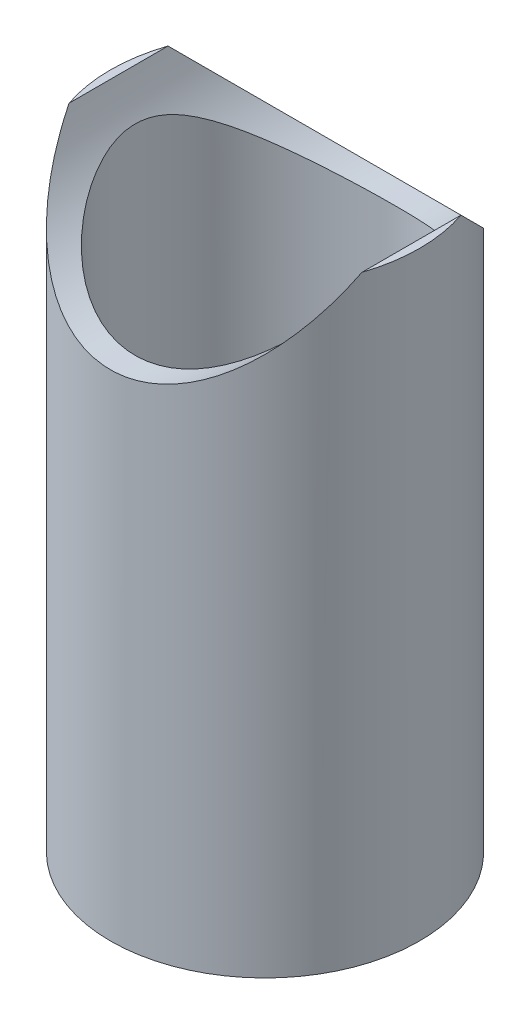
ISO-10303-21;
HEADER;
FILE_DESCRIPTION(('STEP AP214'),'2;1');
FILE_NAME('part.step','',(''),(''),'','','');
FILE_SCHEMA(('AUTOMOTIVE_DESIGN { 1 0 10303 214 1 1 1 1 }'));
ENDSEC;
DATA;
#1=APPLICATION_CONTEXT('core data for automotive mechanical design processes');
#2=APPLICATION_PROTOCOL_DEFINITION('international standard','automotive_design',2000,#1);
#3=PRODUCT_CONTEXT('',#1,'mechanical');
#4=PRODUCT('Part','Part','',(#3));
#5=PRODUCT_RELATED_PRODUCT_CATEGORY('part','',(#4));
#6=PRODUCT_DEFINITION_FORMATION('','',#4);
#7=PRODUCT_DEFINITION_CONTEXT('part definition',#1,'design');
#8=PRODUCT_DEFINITION('design','',#6,#7);
#9=PRODUCT_DEFINITION_SHAPE('','',#8);
#10=(LENGTH_UNIT() NAMED_UNIT(*) SI_UNIT(.MILLI.,.METRE.));
#11=(NAMED_UNIT(*) PLANE_ANGLE_UNIT() SI_UNIT($,.RADIAN.));
#12=(NAMED_UNIT(*) SI_UNIT($,.STERADIAN.) SOLID_ANGLE_UNIT());
#13=UNCERTAINTY_MEASURE_WITH_UNIT(LENGTH_MEASURE(1.E-05),#10,'distance_accuracy_value','');
#14=(GEOMETRIC_REPRESENTATION_CONTEXT(3) GLOBAL_UNCERTAINTY_ASSIGNED_CONTEXT((#13)) GLOBAL_UNIT_ASSIGNED_CONTEXT((#10,
#11,#12)) REPRESENTATION_CONTEXT('',''));
#15=CARTESIAN_POINT('',(0.,0.,0.));
#16=DIRECTION('',(0.,0.,1.));
#17=DIRECTION('',(1.,0.,0.));
#18=AXIS2_PLACEMENT_3D('',#15,#16,#17);
#19=CARTESIAN_POINT('',(0.,48.5,0.));
#20=DIRECTION('',(0.,1.,0.));
#21=DIRECTION('',(0.,0.,1.));
#22=AXIS2_PLACEMENT_3D('',#19,#20,#21);
#23=PLANE('',#22);
#24=DIRECTION('',(0.,0.,1.));
#25=VECTOR('',#24,1.);
#26=CARTESIAN_POINT('',(-11.842719282327,48.5,-12.5));
#27=LINE('',#26,#25);
#28=CARTESIAN_POINT('',(-11.842719282327,48.5,-4.00000000000002));
#29=VERTEX_POINT('',#28);
#30=CARTESIAN_POINT('',(-11.842719282327,48.5,4.00000000000001));
#31=VERTEX_POINT('',#30);
#32=EDGE_CURVE('E72',#29,#31,#27,.T.);
#33=ORIENTED_EDGE('',*,*,#32,.F.);
#34=CARTESIAN_POINT('',(0.,48.5,0.));
#35=DIRECTION('',(0.,1.,0.));
#36=DIRECTION('',(0.,0.,1.));
#37=AXIS2_PLACEMENT_3D('',#34,#35,#36);
#38=CIRCLE('',#37,12.5);
#39=EDGE_CURVE('E49',#29,#31,#38,.T.);
#40=ORIENTED_EDGE('',*,*,#39,.T.);
#41=EDGE_LOOP('',(#33,#40));
#42=FACE_BOUND('',#41,.T.);
#43=ADVANCED_FACE('F34',(#42),#23,.T.);
#44=DIRECTION('',(0.,0.,1.));
#45=VECTOR('',#44,1.);
#46=CARTESIAN_POINT('',(11.842719282327,48.5,-12.5));
#47=LINE('',#46,#45);
#48=CARTESIAN_POINT('',(11.842719282327,48.5,4.00000000000001));
#49=VERTEX_POINT('',#48);
#50=CARTESIAN_POINT('',(11.842719282327,48.5,-4.00000000000002));
#51=VERTEX_POINT('',#50);
#52=EDGE_CURVE('E71',#49,#51,#47,.F.);
#53=ORIENTED_EDGE('',*,*,#52,.F.);
#54=EDGE_CURVE('E11',#49,#51,#38,.T.);
#55=ORIENTED_EDGE('',*,*,#54,.T.);
#56=EDGE_LOOP('',(#53,#55));
#57=FACE_BOUND('',#56,.T.);
#58=ADVANCED_FACE('F77',(#57),#23,.T.);
#59=CARTESIAN_POINT('',(0.,0.,0.));
#60=DIRECTION('',(0.,1.,0.));
#61=DIRECTION('',(0.,0.,1.));
#62=AXIS2_PLACEMENT_3D('',#59,#60,#61);
#63=PLANE('',#62);
#64=CARTESIAN_POINT('',(0.,0.,0.));
#65=DIRECTION('',(0.,1.,0.));
#66=DIRECTION('',(0.,0.,1.));
#67=AXIS2_PLACEMENT_3D('',#64,#65,#66);
#68=CIRCLE('',#67,12.5);
#69=CARTESIAN_POINT('',(0.,0.,12.5));
#70=VERTEX_POINT('',#69);
#71=EDGE_CURVE('E83',#70,#70,#68,.T.);
#72=ORIENTED_EDGE('',*,*,#71,.F.);
#73=EDGE_LOOP('',(#72));
#74=FACE_BOUND('',#73,.T.);
#75=CARTESIAN_POINT('',(0.,0.,0.));
#76=DIRECTION('',(0.,1.,0.));
#77=DIRECTION('',(0.,0.,1.));
#78=AXIS2_PLACEMENT_3D('',#75,#76,#77);
#79=CIRCLE('',#78,10.5);
#80=CARTESIAN_POINT('',(0.,0.,10.5));
#81=VERTEX_POINT('',#80);
#82=EDGE_CURVE('E80',#81,#81,#79,.T.);
#83=ORIENTED_EDGE('',*,*,#82,.T.);
#84=EDGE_LOOP('',(#83));
#85=FACE_BOUND('',#84,.T.);
#86=ADVANCED_FACE('F122',(#74,#85),#63,.F.);
#87=CARTESIAN_POINT('',(0.,48.5,0.));
#88=DIRECTION('',(0.,-1.,0.));
#89=DIRECTION('',(0.,0.,-1.));
#90=AXIS2_PLACEMENT_3D('',#87,#88,#89);
#91=CYLINDRICAL_SURFACE('',#90,12.5);
#92=CARTESIAN_POINT('',(0.,19.,-12.5));
#93=CARTESIAN_POINT('',(-0.218739515789949,18.9999993908735,-12.4999994635907));
#94=CARTESIAN_POINT('',(-0.437486592647651,18.9819985118019,-12.4942046039089));
#95=CARTESIAN_POINT('',(-0.868567253093706,18.9106704511768,-12.4716565543057));
#96=CARTESIAN_POINT('',(-1.08089965843427,18.8573368204552,-12.454901363839));
#97=CARTESIAN_POINT('',(-1.49287306447891,18.7173376969706,-12.4122595908852));
#98=CARTESIAN_POINT('',(-1.69253368346149,18.6307252690735,-12.3863875511298));
#99=CARTESIAN_POINT('',(-2.0744969071279,18.4268579247818,-12.3281725410718));
#100=CARTESIAN_POINT('',(-2.25679651756237,18.309597735586,-12.2958284575098));
#101=CARTESIAN_POINT('',(-2.60473689448745,18.0437897162399,-12.2269266983455));
#102=CARTESIAN_POINT('',(-2.76974023061599,17.8944322526164,-12.1902739433225));
#103=CARTESIAN_POINT('',(-3.07283559233071,17.5703923336315,-12.1174266425772));
#104=CARTESIAN_POINT('',(-3.21092229484498,17.3957048808629,-12.0812321888099));
#105=CARTESIAN_POINT('',(-3.45978487684573,17.0203678637239,-12.012370269974));
#106=CARTESIAN_POINT('',(-3.56975307774839,16.8191592968232,-11.9798196408788));
#107=CARTESIAN_POINT('',(-3.75402292836496,16.3998941405751,-11.9233664449728));
#108=CARTESIAN_POINT('',(-3.82833449433394,16.1818422550308,-11.8994614742253));
#109=CARTESIAN_POINT('',(-3.93682835778228,15.7422934818163,-11.8640030689908));
#110=CARTESIAN_POINT('',(-3.97219742115686,15.5211197456144,-11.8520853732299));
#111=CARTESIAN_POINT('',(-4.00551082647404,15.0756810020443,-11.8408707762137));
#112=CARTESIAN_POINT('',(-4.00346567735333,14.8514168803904,-11.8415703310132));
#113=CARTESIAN_POINT('',(-3.96293451839878,14.4160860377509,-11.8551904771854));
#114=CARTESIAN_POINT('',(-3.92597105327877,14.204858866299,-11.8676004346024));
#115=CARTESIAN_POINT('',(-3.81912647431514,13.7917778888601,-11.9024114349979));
#116=CARTESIAN_POINT('',(-3.74924170672462,13.5899251260173,-11.9248135869381));
#117=CARTESIAN_POINT('',(-3.57749112898224,13.197755352963,-11.9774663544073));
#118=CARTESIAN_POINT('',(-3.47515682759627,13.0076594501287,-12.0078307368189));
#119=CARTESIAN_POINT('',(-3.24173735834848,12.6468448924257,-12.0729361214443));
#120=CARTESIAN_POINT('',(-3.11064442067799,12.4761314931391,-12.1076783053403));
#121=CARTESIAN_POINT('',(-2.81601378851059,12.1503383178364,-12.1796593035711));
#122=CARTESIAN_POINT('',(-2.65122340623531,11.9963980576535,-12.216938020211));
#123=CARTESIAN_POINT('',(-2.29770358054263,11.7180533044153,-12.2883292028654));
#124=CARTESIAN_POINT('',(-2.10897218913167,11.5936512171426,-12.3224414108409));
#125=CARTESIAN_POINT('',(-1.710653951781,11.3770913917996,-12.3840447436164));
#126=CARTESIAN_POINT('',(-1.50090319860161,11.285217247909,-12.411477013699));
#127=CARTESIAN_POINT('',(-1.06783962590281,11.1384010083432,-12.4562040275044));
#128=CARTESIAN_POINT('',(-0.844531157828867,11.0834471304582,-12.4735020051158));
#129=CARTESIAN_POINT('',(-0.400354473973302,11.013999833337,-12.4954856059785));
#130=CARTESIAN_POINT('',(-0.179750715042687,10.9979648159723,-12.5006515044539));
#131=CARTESIAN_POINT('',(0.261025673970264,11.0024480455533,-12.4992163829611));
#132=CARTESIAN_POINT('',(0.481198365218598,11.0229606632747,-12.4926171751051));
#133=CARTESIAN_POINT('',(0.90883754550953,11.0987252827029,-12.4687095079374));
#134=CARTESIAN_POINT('',(1.11648590619506,11.1530497752148,-12.4516871662316));
#135=CARTESIAN_POINT('',(1.51965413650146,11.2937544984906,-12.4089396498837));
#136=CARTESIAN_POINT('',(1.71517248448531,11.3801387415054,-12.3832133859887));
#137=CARTESIAN_POINT('',(2.09399230967611,11.5849275429454,-12.3248882754976));
#138=CARTESIAN_POINT('',(2.27686405125242,11.7040812798558,-12.2921331567523));
#139=CARTESIAN_POINT('',(2.62052875751655,11.9701346824641,-12.223485206012));
#140=CARTESIAN_POINT('',(2.78131543888496,12.1170422161458,-12.187591485802));
#141=CARTESIAN_POINT('',(3.08320803721588,12.4416853990274,-12.1148241820809));
#142=CARTESIAN_POINT('',(3.22321448689051,12.6204506692212,-12.0779721041684));
#143=CARTESIAN_POINT('',(3.47135354981423,12.9997366861455,-12.0090110777536));
#144=CARTESIAN_POINT('',(3.57948642564104,13.2002572536351,-11.9769020901785));
#145=CARTESIAN_POINT('',(3.76018950753079,13.6171089466402,-11.9214065721644));
#146=CARTESIAN_POINT('',(3.83287665768614,13.8333853374742,-11.8979914205013));
#147=CARTESIAN_POINT('',(3.94051670615503,14.2760180245258,-11.8627820424832));
#148=CARTESIAN_POINT('',(3.97548487516417,14.50237020284,-11.8509831134183));
#149=CARTESIAN_POINT('',(4.00556338278915,14.94718992291,-11.8408481974692));
#150=CARTESIAN_POINT('',(4.00248471115016,15.1655225283225,-11.8419004772846));
#151=CARTESIAN_POINT('',(3.96095887873426,15.5983925135868,-11.8558539773436));
#152=CARTESIAN_POINT('',(3.92251352152803,15.8129300864026,-11.8687545933658));
#153=CARTESIAN_POINT('',(3.81258331041153,16.2287085634422,-11.9045135786104));
#154=CARTESIAN_POINT('',(3.74164069856766,16.4301079972322,-11.9272081809191));
#155=CARTESIAN_POINT('',(3.56916068710955,16.818304401002,-11.9799493898591));
#156=CARTESIAN_POINT('',(3.46761685286564,17.0050982894068,-12.009997542498));
#157=CARTESIAN_POINT('',(3.2319816676858,17.367024074536,-12.0755873592094));
#158=CARTESIAN_POINT('',(3.09673271078946,17.5413706568351,-12.111302976317));
#159=CARTESIAN_POINT('',(2.79953499482211,17.8654793645524,-12.1834295211838));
#160=CARTESIAN_POINT('',(2.63757895417057,18.0152347629966,-12.2198406361674));
#161=CARTESIAN_POINT('',(2.28478052574588,18.2911457148096,-12.2907777050029));
#162=CARTESIAN_POINT('',(2.09312837940195,18.4162973797108,-12.3251937970096));
#163=CARTESIAN_POINT('',(1.69040882481734,18.6324504702431,-12.3868446924465));
#164=CARTESIAN_POINT('',(1.47934815802039,18.723463698302,-12.4140819767823));
#165=CARTESIAN_POINT('',(1.05915857911211,18.8631194495761,-12.4567085266016));
#166=CARTESIAN_POINT('',(0.850941916218326,18.9142961264578,-12.4727975325363));
#167=CARTESIAN_POINT('',(0.4284850026903,18.98273285726,-12.4944423385349));
#168=CARTESIAN_POINT('',(0.214246128153487,19.0000005966137,-12.5000005253903));
#169=CARTESIAN_POINT('',(0.,19.,-12.5));
#170=B_SPLINE_CURVE_WITH_KNOTS('',3,(#92,#93,#94,#95,#96,#97,#98,#99,#100,#101,#102,#103,#104,
#105,#106,#107,#108,#109,#110,#111,#112,#113,#114,#115,#116,#117,#118,#119,#120,#121,#122,#123,
#124,#125,#126,#127,#128,#129,#130,#131,#132,#133,#134,#135,#136,#137,#138,#139,#140,#141,#142,
#143,#144,#145,#146,#147,#148,#149,#150,#151,#152,#153,#154,#155,#156,#157,#158,#159,#160,#161,
#162,#163,#164,#165,#166,#167,#168,#169),.UNSPECIFIED.,.T.,.F.,(4,2,2,2,2,2,2,2,2,2,2,2,2,2,2,2,
2,2,2,2,2,2,2,2,2,2,2,2,2,2,2,2,2,2,2,2,2,2,4),(0.,0.655430724666218,1.31098111587091,
1.96549050527928,2.62011257411758,3.29374295378918,3.96750641671065,4.65887072066567,
5.35004264179887,6.01951224998766,6.68879381985559,7.33017723381302,7.97163184802041,
8.62280489842004,9.27415409537618,9.95668212026653,10.6392657156648,11.3276617834058,
12.0158380617097,12.6762752648346,13.3366107533684,13.9795854097457,14.6226405610093,
15.281833876428,15.9412143491714,16.6280748263774,17.3149296449995,17.9995027669286,
18.6837986322709,19.3356533743721,19.9874748761257,20.6287955720839,21.2702512150686,
21.937843916949,22.6056189371905,23.2966571383324,23.9874562112942,24.6295685076846,
25.2715352530413),.UNSPECIFIED.);
#171=CARTESIAN_POINT('',(0.,19.,-12.5));
#172=VERTEX_POINT('',#171);
#173=EDGE_CURVE('E93',#172,#172,#170,.T.);
#174=ORIENTED_EDGE('',*,*,#173,.T.);
#175=EDGE_LOOP('',(#174));
#176=FACE_BOUND('',#175,.T.);
#177=ORIENTED_EDGE('',*,*,#39,.F.);
#178=CARTESIAN_POINT('',(0.,52.5,0.));
#179=DIRECTION('',(0.,-0.707106781186547,0.707106781186548));
#180=DIRECTION('',(0.,-0.707106781186547,-0.707106781186548));
#181=AXIS2_PLACEMENT_3D('',#178,#179,#180);
#182=ELLIPSE('',#181,17.6776695296637,12.5);
#183=EDGE_CURVE('E64',#29,#51,#182,.T.);
#184=ORIENTED_EDGE('',*,*,#183,.T.);
#185=ORIENTED_EDGE('',*,*,#54,.F.);
#186=CARTESIAN_POINT('',(0.,52.5,0.));
#187=DIRECTION('',(0.,-0.707106781186547,-0.707106781186548));
#188=DIRECTION('',(0.,-0.707106781186547,0.707106781186548));
#189=AXIS2_PLACEMENT_3D('',#186,#187,#188);
#190=ELLIPSE('',#189,17.6776695296637,12.5);
#191=EDGE_CURVE('E57',#49,#31,#190,.T.);
#192=ORIENTED_EDGE('',*,*,#191,.T.);
#193=EDGE_LOOP('',(#177,#184,#185,#192));
#194=FACE_BOUND('',#193,.T.);
#195=ORIENTED_EDGE('',*,*,#71,.T.);
#196=EDGE_LOOP('',(#195));
#197=FACE_BOUND('',#196,.T.);
#198=ADVANCED_FACE('F36',(#176,#194,#197),#91,.T.);
#199=CARTESIAN_POINT('',(0.,48.5,0.));
#200=DIRECTION('',(0.,-1.,0.));
#201=DIRECTION('',(0.,0.,-1.));
#202=AXIS2_PLACEMENT_3D('',#199,#200,#201);
#203=CYLINDRICAL_SURFACE('',#202,10.5);
#204=CARTESIAN_POINT('',(0.,19.,-10.5));
#205=CARTESIAN_POINT('',(-0.10816249402773,19.0000005150444,-10.5000003990163));
#206=CARTESIAN_POINT('',(-0.216317226805301,18.9956092681695,-10.498325014305));
#207=CARTESIAN_POINT('',(-0.431849643724885,18.9780899805564,-10.4916697381702));
#208=CARTESIAN_POINT('',(-0.539227073934133,18.9649592043836,-10.4866888121283));
#209=CARTESIAN_POINT('',(-0.752320696488628,18.9300964867436,-10.4735569967627));
#210=CARTESIAN_POINT('',(-0.858037791884633,18.908369402015,-10.4654078974374));
#211=CARTESIAN_POINT('',(-1.0671353505947,18.8565329403734,-10.4461608718977));
#212=CARTESIAN_POINT('',(-1.17051488831636,18.8264203038048,-10.4350617990379));
#213=CARTESIAN_POINT('',(-1.47558283514815,18.724042508179,-10.3978067790511));
#214=CARTESIAN_POINT('',(-1.67285936734757,18.6396281598818,-10.3676498105204));
#215=CARTESIAN_POINT('',(-2.05031727397607,18.4411878776011,-10.299666313908));
#216=CARTESIAN_POINT('',(-2.23049389377237,18.327153740576,-10.2618376618319));
#217=CARTESIAN_POINT('',(-2.5766497031808,18.0674875842774,-10.180554964499));
#218=CARTESIAN_POINT('',(-2.74179208879201,17.9207894427593,-10.1369382145426));
#219=CARTESIAN_POINT('',(-3.04580227070822,17.6022307048775,-10.0497839456605));
#220=CARTESIAN_POINT('',(-3.18466164651555,17.4303620756187,-10.0062464565375));
#221=CARTESIAN_POINT('',(-3.43759067140565,17.0580505873953,-9.92227089475135));
#222=CARTESIAN_POINT('',(-3.55046194725449,16.856746147166,-9.88202363996857));
#223=CARTESIAN_POINT('',(-3.74037141287278,16.4362386628448,-9.81172534045626));
#224=CARTESIAN_POINT('',(-3.81742443699259,16.2170430727797,-9.78167007604848));
#225=CARTESIAN_POINT('',(-3.93017824100957,15.7766341961246,-9.73690200644289));
#226=CARTESIAN_POINT('',(-3.96748208073975,15.5558935959044,-9.72159703172023));
#227=CARTESIAN_POINT('',(-4.00468984551249,15.1107958510282,-9.70633324256615));
#228=CARTESIAN_POINT('',(-4.00460985794797,14.8864403035571,-9.70636782705756));
#229=CARTESIAN_POINT('',(-3.96827544359677,14.4553149514076,-9.72126995333423));
#230=CARTESIAN_POINT('',(-3.93426697528439,14.2483180568447,-9.7352165560286));
#231=CARTESIAN_POINT('',(-3.83476135417431,13.8432273797753,-9.77483723186729));
#232=CARTESIAN_POINT('',(-3.76925930288112,13.6451349875134,-9.80051312934899));
#233=CARTESIAN_POINT('',(-3.60742653694748,13.2589769749522,-9.86123925884152));
#234=CARTESIAN_POINT('',(-3.51052547585192,13.0711785040024,-9.89646077806254));
#235=CARTESIAN_POINT('',(-3.28904350320094,12.7138645896738,-9.97225487445738));
#236=CARTESIAN_POINT('',(-3.16445282285844,12.544355630191,-10.0128293380705));
#237=CARTESIAN_POINT('',(-2.88093153401433,12.2160319347756,-10.098198009063));
#238=CARTESIAN_POINT('',(-2.72021551806992,12.0587803989862,-10.1430894548339));
#239=CARTESIAN_POINT('',(-2.37418548986823,11.772988219828,-10.2296147927583));
#240=CARTESIAN_POINT('',(-2.18886745928642,11.6444522758881,-10.2712481509886));
#241=CARTESIAN_POINT('',(-1.79480303538512,11.4179413582927,-10.3474418684759));
#242=CARTESIAN_POINT('',(-1.58572200847312,11.3205026599626,-10.3818749104512));
#243=CARTESIAN_POINT('',(-1.15249572744745,11.1627052260532,-10.4388398644991));
#244=CARTESIAN_POINT('',(-0.928357439708988,11.1023294722772,-10.4613772380398));
#245=CARTESIAN_POINT('',(-0.484523009213258,11.0234132608212,-10.4910432028467));
#246=CARTESIAN_POINT('',(-0.265252397194593,11.0027687972982,-10.4989458483901));
#247=CARTESIAN_POINT('',(0.173737961654984,10.9977546498181,-10.5008547488942));
#248=CARTESIAN_POINT('',(0.393457593454624,11.013376615127,-10.4948642029118));
#249=CARTESIAN_POINT('',(0.817913686095789,11.078864327976,-10.4701697602295));
#250=CARTESIAN_POINT('',(1.02289813910183,11.1273383153954,-10.4519828724505));
#251=CARTESIAN_POINT('',(1.42166989788425,11.2553073461509,-10.4052481788068));
#252=CARTESIAN_POINT('',(1.61545574573832,11.3348064181774,-10.3766990274081));
#253=CARTESIAN_POINT('',(1.9927891646072,11.5251230211724,-10.3109930092378));
#254=CARTESIAN_POINT('',(2.17586131381993,11.6368010843665,-10.2736055464757));
#255=CARTESIAN_POINT('',(2.52128853254048,11.8873373245465,-10.1943397182704));
#256=CARTESIAN_POINT('',(2.68363574715142,12.0262057566476,-10.1524596611039));
#257=CARTESIAN_POINT('',(2.99318363841576,12.3369615450801,-10.0656958243216));
#258=CARTESIAN_POINT('',(3.13889454803496,12.5103284670112,-10.0207823869792));
#259=CARTESIAN_POINT('',(3.39946665140979,12.8799174370249,-9.93541546836318));
#260=CARTESIAN_POINT('',(3.5143245842607,13.0761418978208,-9.89496245878614));
#261=CARTESIAN_POINT('',(3.71017634656927,13.4877865894829,-9.8232166467957));
#262=CARTESIAN_POINT('',(3.79098632301296,13.7033036052746,-9.79197384330408));
#263=CARTESIAN_POINT('',(3.91461506348578,14.1464156298834,-9.74321766225741));
#264=CARTESIAN_POINT('',(3.95745836544685,14.3740027368118,-9.72569541793324));
#265=CARTESIAN_POINT('',(4.00170805085329,14.8185941351978,-9.70756665590346));
#266=CARTESIAN_POINT('',(4.00566532901142,15.0353040622839,-9.70591893197156));
#267=CARTESIAN_POINT('',(3.97860439692361,15.4661308249143,-9.71704265847931));
#268=CARTESIAN_POINT('',(3.94758972913404,15.6802479208771,-9.72981264848788));
#269=CARTESIAN_POINT('',(3.85347442451017,16.0927282305389,-9.76745395680423));
#270=CARTESIAN_POINT('',(3.7914498042727,16.2913773091394,-9.791918317935));
#271=CARTESIAN_POINT('',(3.63803895458147,16.6755565960333,-9.84994250999594));
#272=CARTESIAN_POINT('',(3.54664519310975,16.8610834240826,-9.88350467380524));
#273=CARTESIAN_POINT('',(3.33140020609057,17.2245759126208,-9.95818178782136));
#274=CARTESIAN_POINT('',(3.20607159301319,17.4016029949418,-9.99960518617515));
#275=CARTESIAN_POINT('',(2.92880801478986,17.7329127794141,-10.0843001164454));
#276=CARTESIAN_POINT('',(2.77686445734789,17.8871881067342,-10.1275722417784));
#277=CARTESIAN_POINT('',(2.44027354764005,18.1775962048772,-10.2140487965206));
#278=CARTESIAN_POINT('',(2.25426250745181,18.3122092231329,-10.257110957244));
#279=CARTESIAN_POINT('',(1.9593594395281,18.4891432262043,-10.3160576713636));
#280=CARTESIAN_POINT('',(1.85833951741952,18.5439845983214,-10.3347758601238));
#281=CARTESIAN_POINT('',(1.65163041646008,18.6449034298382,-10.3698156858563));
#282=CARTESIAN_POINT('',(1.54594322589825,18.6909845776092,-10.3861383307763));
#283=CARTESIAN_POINT('',(1.32443531685051,18.7763423524983,-10.4167693103109));
#284=CARTESIAN_POINT('',(1.20838133448251,18.8150754495795,-10.4309078828893));
#285=CARTESIAN_POINT('',(0.972896990915021,18.8818086519735,-10.455499775536));
#286=CARTESIAN_POINT('',(0.853468150848941,18.9098135124632,-10.4659547281643));
#287=CARTESIAN_POINT('',(0.612288901104484,18.9547625262345,-10.4828293964664));
#288=CARTESIAN_POINT('',(0.490538968994093,18.9717089300621,-10.4892499331887));
#289=CARTESIAN_POINT('',(0.245855911325711,18.9943266323294,-10.4978347281402));
#290=CARTESIAN_POINT('',(0.122922943626598,18.9999994146698,-10.4999995465317));
#291=CARTESIAN_POINT('',(0.,19.,-10.5));
#292=B_SPLINE_CURVE_WITH_KNOTS('',3,(#204,#205,#206,#207,#208,#209,#210,#211,#212,#213,#214,
#215,#216,#217,#218,#219,#220,#221,#222,#223,#224,#225,#226,#227,#228,#229,#230,#231,#232,#233,
#234,#235,#236,#237,#238,#239,#240,#241,#242,#243,#244,#245,#246,#247,#248,#249,#250,#251,#252,
#253,#254,#255,#256,#257,#258,#259,#260,#261,#262,#263,#264,#265,#266,#267,#268,#269,#270,#271,
#272,#273,#274,#275,#276,#277,#278,#279,#280,#281,#282,#283,#284,#285,#286,#287,#288,#289,#290,
#291),.UNSPECIFIED.,.T.,.F.,(4,2,2,2,2,2,2,2,2,2,2,2,2,2,2,2,2,2,2,2,2,2,2,2,2,2,2,2,2,2,2,2,2,
2,2,2,2,2,2,2,2,2,2,4),(0.,0.324371786327612,0.648845147382416,0.973135448801638,
1.29755198566072,1.94440281970489,2.59143298698129,3.26390430627755,3.93659070725503,
4.63589568201203,5.33491077668675,6.00452340011213,6.67384786921408,7.30162176624104,
7.92949333849601,8.56947733254202,9.20968746981433,9.89441427873913,10.5792530641654,
11.2753331376542,11.971093352431,12.6288692357383,13.286493674117,13.9178684674292,
14.5493252737442,15.1995482031768,15.8500168446279,16.5394482941168,17.2289525821686,
17.9221337821842,18.6148666504818,19.2618271918955,19.9087222058254,20.5345843422223,
21.1606071156633,21.8201912873082,22.4799887910923,23.1771058804177,23.52612041901,
23.8749876828147,24.2439123442336,24.6126732939945,24.981359172469,25.3499965191133),.UNSPECIFIED.);
#293=CARTESIAN_POINT('',(0.,19.,-10.5));
#294=VERTEX_POINT('',#293);
#295=EDGE_CURVE('E39',#294,#294,#292,.T.);
#296=ORIENTED_EDGE('',*,*,#295,.F.);
#297=EDGE_LOOP('',(#296));
#298=FACE_BOUND('',#297,.T.);
#299=CARTESIAN_POINT('',(0.,40.,-10.5));
#300=CARTESIAN_POINT('',(0.248562084588282,40.0000021322651,-10.4999978268656));
#301=CARTESIAN_POINT('',(0.497166276236075,40.0074307780488,-10.4911572154357));
#302=CARTESIAN_POINT('',(0.992356714631305,40.0369822461103,-10.4559504919801));
#303=CARTESIAN_POINT('',(1.2389417862411,40.0591130842341,-10.4295748195822));
#304=CARTESIAN_POINT('',(1.72842752580616,40.1176171962477,-10.3597185683379));
#305=CARTESIAN_POINT('',(1.97132050731128,40.1540168240968,-10.3162063381661));
#306=CARTESIAN_POINT('',(2.45117661916314,40.2402619068266,-10.212834534971));
#307=CARTESIAN_POINT('',(2.68813899011461,40.2901090740922,-10.1529728800298));
#308=CARTESIAN_POINT('',(3.1530101590087,40.4018474189856,-10.0183180853129));
#309=CARTESIAN_POINT('',(3.3809694417384,40.4636546591484,-9.94362891750097));
#310=CARTESIAN_POINT('',(3.82834267194039,40.5983876408329,-9.78010852873046));
#311=CARTESIAN_POINT('',(4.04775656080019,40.6713134585997,-9.69127721079274));
#312=CARTESIAN_POINT('',(4.47710570747059,40.8270541864598,-9.50056280812407));
#313=CARTESIAN_POINT('',(4.68704322706934,40.9098667194416,-9.39868286031208));
#314=CARTESIAN_POINT('',(5.09689877557857,41.0841671218123,-9.18288001519313));
#315=CARTESIAN_POINT('',(5.29681490936725,41.1756566226935,-9.06895485261291));
#316=CARTESIAN_POINT('',(5.75847592808848,41.4014310942219,-8.78567271566155));
#317=CARTESIAN_POINT('',(6.01563656867873,41.5389987216593,-8.61143334929456));
#318=CARTESIAN_POINT('',(6.50976869164252,41.825053804269,-8.24425480363067));
#319=CARTESIAN_POINT('',(6.7467331749579,41.9735450121034,-8.05130919072702));
#320=CARTESIAN_POINT('',(7.20081390093552,42.2787820827151,-7.64792426780393));
#321=CARTESIAN_POINT('',(7.41787802591707,42.4355480164106,-7.43744163186533));
#322=CARTESIAN_POINT('',(7.83144460361016,42.7538952183686,-7.00063855001155));
#323=CARTESIAN_POINT('',(8.02794968707478,42.9154758671279,-6.77432013665647));
#324=CARTESIAN_POINT('',(8.40398245782183,43.2433026487824,-6.30205698836679));
#325=CARTESIAN_POINT('',(8.58311896077279,43.4095792341296,-6.05582210564819));
#326=CARTESIAN_POINT('',(8.92004458965511,43.7399511433739,-5.54759401852089));
#327=CARTESIAN_POINT('',(9.07782656165746,43.9040457197619,-5.28559557545324));
#328=CARTESIAN_POINT('',(9.37116159772917,44.2248299479787,-4.74609601764618));
#329=CARTESIAN_POINT('',(9.50676538103956,44.3815358952126,-4.46863227727921));
#330=CARTESIAN_POINT('',(9.75507515004185,44.6816670765257,-3.89686229776072));
#331=CARTESIAN_POINT('',(9.86780044602849,44.8251034544932,-3.60257053329901));
#332=CARTESIAN_POINT('',(10.0224697947442,45.0295063071446,-3.13527923622864));
#333=CARTESIAN_POINT('',(10.0731768168996,45.0981424570515,-2.96850135318263));
#334=CARTESIAN_POINT('',(10.1668907802346,45.2274013803838,-2.62968260813994));
#335=CARTESIAN_POINT('',(10.2098967037137,45.2880230944244,-2.45764105406098));
#336=CARTESIAN_POINT('',(10.287591966008,45.3992916855299,-2.10886290227498));
#337=CARTESIAN_POINT('',(10.3222967773894,45.4499570883422,-1.9321357323619));
#338=CARTESIAN_POINT('',(10.3828936604183,45.5395079843781,-1.57429963100747));
#339=CARTESIAN_POINT('',(10.408790408989,45.5783997279934,-1.39319307983141));
#340=CARTESIAN_POINT('',(10.451517052049,45.6430817273272,-1.02498360046767));
#341=CARTESIAN_POINT('',(10.468218812576,45.6686865588435,-0.837832615201697));
#342=CARTESIAN_POINT('',(10.4915497315563,45.7045712534454,-0.46143740278924));
#343=CARTESIAN_POINT('',(10.4981799524108,45.7148527329201,-0.272193398547475));
#344=CARTESIAN_POINT('',(10.5011666196754,45.719475756071,0.106532453985569));
#345=CARTESIAN_POINT('',(10.4975253780499,45.7138208867996,0.29601423915942));
#346=CARTESIAN_POINT('',(10.480087650195,45.6869235557159,0.673393642409604));
#347=CARTESIAN_POINT('',(10.4662900152255,45.6656793306683,0.861291078856234));
#348=CARTESIAN_POINT('',(10.4277309410028,45.6069796299068,1.24584765836055));
#349=CARTESIAN_POINT('',(10.4023222741363,45.5685706298578,1.44229448911254));
#350=CARTESIAN_POINT('',(10.3411128953599,45.4775805316548,1.83030347366254));
#351=CARTESIAN_POINT('',(10.3053049655366,45.4249895919274,2.021862133879));
#352=CARTESIAN_POINT('',(10.2239297322322,45.3078970810179,2.3997352107875));
#353=CARTESIAN_POINT('',(10.1783355329049,45.2433627542601,2.5860335406318));
#354=CARTESIAN_POINT('',(10.0781393566931,45.1048378661102,2.9524883784916));
#355=CARTESIAN_POINT('',(10.0235391171123,45.0308491291336,3.13264606299193));
#356=CARTESIAN_POINT('',(9.87023359323051,44.8284367520343,3.59421255120813));
#357=CARTESIAN_POINT('',(9.76484454596291,44.6941852640279,3.87085778052344));
#358=CARTESIAN_POINT('',(9.5338562886521,44.4136737166125,4.40924766305801));
#359=CARTESIAN_POINT('',(9.40824471107901,44.2674063356021,4.67098306437943));
#360=CARTESIAN_POINT('',(9.13755744006972,43.9679516257532,5.18057633779807));
#361=CARTESIAN_POINT('',(8.9924551278013,43.8147550267677,5.42841456231413));
#362=CARTESIAN_POINT('',(8.68339825610899,43.5057594840583,5.91020118926807));
#363=CARTESIAN_POINT('',(8.51944762695665,43.3499610886343,6.14415247205397));
#364=CARTESIAN_POINT('',(8.16257077466873,43.0298764056377,6.61165191984483));
#365=CARTESIAN_POINT('',(7.96850535431513,42.8656320260651,6.84436089949182));
#366=CARTESIAN_POINT('',(7.55932468571513,42.541346403426,7.29376112028163));
#367=CARTESIAN_POINT('',(7.34420637560988,42.3813057760445,7.51045002345183));
#368=CARTESIAN_POINT('',(6.89332128364505,42.0689300806623,7.92628559222369));
#369=CARTESIAN_POINT('',(6.6575915473344,41.916581933978,8.12546249064649));
#370=CARTESIAN_POINT('',(6.16533139948409,41.6224617237015,8.50501095826824));
#371=CARTESIAN_POINT('',(5.9088073246471,41.4806864633082,8.68538821830809));
#372=CARTESIAN_POINT('',(5.43623426538273,41.2416419034236,8.98648827267997));
#373=CARTESIAN_POINT('',(5.22427701686791,41.1415913191959,9.11144000740812));
#374=CARTESIAN_POINT('',(4.78873076526314,40.9512116639907,9.3476952693627));
#375=CARTESIAN_POINT('',(4.56514445471194,40.8608803573899,9.45900193604528));
#376=CARTESIAN_POINT('',(4.10709315253862,40.6914695492112,9.66669530332886));
#377=CARTESIAN_POINT('',(3.87263111771101,40.6123870129199,9.76308602859867));
#378=CARTESIAN_POINT('',(3.3938271276375,40.4669402421838,9.93966973216893));
#379=CARTESIAN_POINT('',(3.14948503673471,40.4005761824404,10.0198624879745));
#380=CARTESIAN_POINT('',(2.6502872430694,40.2814747709373,10.1633643591521));
#381=CARTESIAN_POINT('',(2.39536065190326,40.2288561407836,10.2265265196215));
#382=CARTESIAN_POINT('',(1.87882869801891,40.1392274619663,10.33390405469));
#383=CARTESIAN_POINT('',(1.61722330966736,40.1022174732185,10.3781193565592));
#384=CARTESIAN_POINT('',(1.0897832191831,40.0447723330956,10.4466763372047));
#385=CARTESIAN_POINT('',(0.823951377755071,40.0243264196533,10.4710309200228));
#386=CARTESIAN_POINT('',(0.29045547056159,40.0005239835333,10.4993791232424));
#387=CARTESIAN_POINT('',(0.0227916407307276,39.9971653002355,10.5033753178904));
#388=CARTESIAN_POINT('',(-0.477160839545771,40.0069404680499,10.4917367375065));
#389=CARTESIAN_POINT('',(-0.709553856169765,40.0180004321448,10.4785705255014));
#390=CARTESIAN_POINT('',(-1.17197868198823,40.0529034087357,10.4369699960918));
#391=CARTESIAN_POINT('',(-1.40201073257876,40.0767451008281,10.4085372557801));
#392=CARTESIAN_POINT('',(-1.8581190314894,40.1367352980729,10.336861123901));
#393=CARTESIAN_POINT('',(-2.08419516501589,40.1728841597365,10.2936173032894));
#394=CARTESIAN_POINT('',(-2.53096816275334,40.2568031141555,10.1929701982608));
#395=CARTESIAN_POINT('',(-2.75166478250151,40.3045737339625,10.1355662716752));
#396=CARTESIAN_POINT('',(-3.1866178984218,40.4109291776178,10.0073431218967));
#397=CARTESIAN_POINT('',(-3.40086963237272,40.4695217802959,9.93651424789957));
#398=CARTESIAN_POINT('',(-3.82187563680372,40.5965702481652,9.78230799862387));
#399=CARTESIAN_POINT('',(-4.02862699580374,40.6650298933131,9.69892581376031));
#400=CARTESIAN_POINT('',(-4.43380261179976,40.8107849955868,9.52052488464063));
#401=CARTESIAN_POINT('',(-4.63222705392571,40.8880802561304,9.42550639927526));
#402=CARTESIAN_POINT('',(-5.02024349331819,41.0504841349749,9.22468964103474));
#403=CARTESIAN_POINT('',(-5.20983370083134,41.1355943262398,9.11888919752903));
#404=CARTESIAN_POINT('',(-5.66199338115723,41.3519280241064,8.84809555288121));
#405=CARTESIAN_POINT('',(-5.91957567022361,41.4868429494654,8.67768328262174));
#406=CARTESIAN_POINT('',(-6.41492226057665,41.7678090229873,8.3182033034679));
#407=CARTESIAN_POINT('',(-6.65267896542988,41.9138643990913,8.12912850382351));
#408=CARTESIAN_POINT('',(-7.10866634301928,42.2144951360662,7.73357542325358));
#409=CARTESIAN_POINT('',(-7.3268469100986,42.3690908105517,7.52705497062528));
#410=CARTESIAN_POINT('',(-7.74296587108011,42.6834596595689,7.09829093084483));
#411=CARTESIAN_POINT('',(-7.94090692812349,42.843232149276,6.8760494188177));
#412=CARTESIAN_POINT('',(-8.32004293022497,43.1677834295321,6.41234926840393));
#413=CARTESIAN_POINT('',(-8.50086668055365,43.3326003828162,6.17061409932166));
#414=CARTESIAN_POINT('',(-8.84156428778837,43.6607317377876,5.67168669603174));
#415=CARTESIAN_POINT('',(-9.00143187147897,43.824045676007,5.41448986684025));
#416=CARTESIAN_POINT('',(-9.29946217194347,44.1442991644684,4.88489251511668));
#417=CARTESIAN_POINT('',(-9.43766816018634,44.3012509462847,4.61252381519073));
#418=CARTESIAN_POINT('',(-9.69180323605071,44.603304845986,4.05138547469954));
#419=CARTESIAN_POINT('',(-9.80774880922952,44.7484156868507,3.76262817809713));
#420=CARTESIAN_POINT('',(-9.9695281601916,44.9589406844805,3.29987333815704));
#421=CARTESIAN_POINT('',(-10.0236392607072,45.0311406811315,3.1318265112228));
#422=CARTESIAN_POINT('',(-10.1240377458319,45.167808300633,2.79026021917177));
#423=CARTESIAN_POINT('',(-10.1703239913213,45.2322747972672,2.61673996160432));
#424=CARTESIAN_POINT('',(-10.2544557026998,45.3514713748519,2.26469164943964));
#425=CARTESIAN_POINT('',(-10.2923151391495,45.406217539901,2.08617244418551));
#426=CARTESIAN_POINT('',(-10.3590680345202,45.5040566635206,1.72438828073241));
#427=CARTESIAN_POINT('',(-10.387966316233,45.5471558887309,1.54112593298243));
#428=CARTESIAN_POINT('',(-10.4365645721059,45.6203131016382,1.16791823944645));
#429=CARTESIAN_POINT('',(-10.456122853831,45.650169738486,0.977914224859425));
#430=CARTESIAN_POINT('',(-10.4848649348557,45.6942442068667,0.595308721239135));
#431=CARTESIAN_POINT('',(-10.4940497703224,45.7084636003452,0.402707493577491));
#432=CARTESIAN_POINT('',(-10.5017579290086,45.7203883624038,0.0168864395907359));
#433=CARTESIAN_POINT('',(-10.5002875313482,45.718103456956,-0.176332955349935));
#434=CARTESIAN_POINT('',(-10.4867466908594,45.6971847479437,-0.561498025197002));
#435=CARTESIAN_POINT('',(-10.4746763194296,45.6785510544998,-0.75344370867398));
#436=CARTESIAN_POINT('',(-10.4428660322922,45.6299752683545,-1.10591724281183));
#437=CARTESIAN_POINT('',(-10.4245345490709,45.6021283657831,-1.26687022981237));
#438=CARTESIAN_POINT('',(-10.3808096964283,45.5364990166708,-1.58578657407983));
#439=CARTESIAN_POINT('',(-10.3554138081778,45.4987130265884,-1.74374884350388));
#440=CARTESIAN_POINT('',(-10.269157817658,45.3722520737184,-2.21254638536511));
#441=CARTESIAN_POINT('',(-10.1982496359929,45.2705067270033,-2.5180772094441));
#442=CARTESIAN_POINT('',(-10.0410318376869,45.0539459283666,-3.08302874769848));
#443=CARTESIAN_POINT('',(-9.95696057832647,44.941442666043,-3.34401063732676));
#444=CARTESIAN_POINT('',(-9.77116172756689,44.7027379033205,-3.8532937376865));
#445=CARTESIAN_POINT('',(-9.66942112175631,44.5765263318742,-4.10158542570502));
#446=CARTESIAN_POINT('',(-9.44912085971315,44.3150487685069,-4.58641509267862));
#447=CARTESIAN_POINT('',(-9.33052153584304,44.1797618309311,-4.82292352138555));
#448=CARTESIAN_POINT('',(-9.0773237506065,43.9042329688937,-5.28406573992813));
#449=CARTESIAN_POINT('',(-8.94272898720666,43.763992194952,-5.50870225713428));
#450=CARTESIAN_POINT('',(-8.64807053223567,43.4718877584619,-5.96143686500247));
#451=CARTESIAN_POINT('',(-8.48689464246937,43.3198850365969,-6.18872139609301));
#452=CARTESIAN_POINT('',(-8.14670231765372,43.016689442335,-6.63014954360722));
#453=CARTESIAN_POINT('',(-7.96768395036033,42.8654966595224,-6.84429173271994));
#454=CARTESIAN_POINT('',(-7.59205152891055,42.566809764475,-7.2587090812635));
#455=CARTESIAN_POINT('',(-7.39545991180505,42.4193112352075,-7.45900136009018));
#456=CARTESIAN_POINT('',(-6.98448615955673,42.1303305530673,-7.84515333692785));
#457=CARTESIAN_POINT('',(-6.77010627469332,41.9888476426118,-8.03101485474084));
#458=CARTESIAN_POINT('',(-6.34520594196477,41.7276088339976,-8.36987988650523));
#459=CARTESIAN_POINT('',(-6.13631361434815,41.6070744288893,-8.52432306971309));
#460=CARTESIAN_POINT('',(-5.70430426019884,41.3747565202051,-8.81925696312383));
#461=CARTESIAN_POINT('',(-5.48118950960325,41.2629716228396,-8.95974989655198));
#462=CARTESIAN_POINT('',(-5.02121411682591,41.0500383147433,-9.22539563694754));
#463=CARTESIAN_POINT('',(-4.7843565751065,40.9488875192592,-9.35055188429448));
#464=CARTESIAN_POINT('',(-4.29766024182441,40.7591187800339,-9.58399248713883));
#465=CARTESIAN_POINT('',(-4.04782417218083,40.6704982227854,-9.69228036145521));
#466=CARTESIAN_POINT('',(-3.57733679945747,40.5207059614009,-9.8744986699181));
#467=CARTESIAN_POINT('',(-3.35841425480748,40.4574111723593,-9.95115411003129));
#468=CARTESIAN_POINT('',(-2.91328663681119,40.3420564381057,-10.0904468224301));
#469=CARTESIAN_POINT('',(-2.68708301427645,40.2899942704377,-10.1530868678548));
#470=CARTESIAN_POINT('',(-2.22911467960863,40.1981514450251,-10.2633525982081));
#471=CARTESIAN_POINT('',(-1.99736269162204,40.1583451362463,-10.3110096464459));
#472=CARTESIAN_POINT('',(-1.52944069655735,40.0916718758747,-10.3907211482993));
#473=CARTESIAN_POINT('',(-1.29327289242712,40.0647986422345,-10.4227831770429));
#474=CARTESIAN_POINT('',(-0.880804976153713,40.0298342426559,-10.4644695357754));
#475=CARTESIAN_POINT('',(-0.70512551219368,40.0186600052402,-10.4777798995309));
#476=CARTESIAN_POINT('',(-0.352971207568597,40.003741404534,-10.4955467639751));
#477=CARTESIAN_POINT('',(-0.17649621893014,39.9999984859448,-10.5000015430753));
#478=CARTESIAN_POINT('',(0.,40.,-10.5));
#479=B_SPLINE_CURVE_WITH_KNOTS('',3,(#299,#300,#301,#302,#303,#304,#305,#306,#307,#308,#309,
#310,#311,#312,#313,#314,#315,#316,#317,#318,#319,#320,#321,#322,#323,#324,#325,#326,#327,#328,
#329,#330,#331,#332,#333,#334,#335,#336,#337,#338,#339,#340,#341,#342,#343,#344,#345,#346,#347,
#348,#349,#350,#351,#352,#353,#354,#355,#356,#357,#358,#359,#360,#361,#362,#363,#364,#365,#366,
#367,#368,#369,#370,#371,#372,#373,#374,#375,#376,#377,#378,#379,#380,#381,#382,#383,#384,#385,
#386,#387,#388,#389,#390,#391,#392,#393,#394,#395,#396,#397,#398,#399,#400,#401,#402,#403,#404,
#405,#406,#407,#408,#409,#410,#411,#412,#413,#414,#415,#416,#417,#418,#419,#420,#421,#422,#423,
#424,#425,#426,#427,#428,#429,#430,#431,#432,#433,#434,#435,#436,#437,#438,#439,#440,#441,#442,
#443,#444,#445,#446,#447,#448,#449,#450,#451,#452,#453,#454,#455,#456,#457,#458,#459,#460,#461,
#462,#463,#464,#465,#466,#467,#468,#469,#470,#471,#472,#473,#474,#475,#476,#477,#478),
.UNSPECIFIED.,.T.,.F.,(4,2,2,2,2,2,2,2,2,2,2,2,2,2,2,2,2,2,2,2,2,2,2,2,2,2,2,2,2,2,2,2,2,2,2,2,
2,2,2,2,2,2,2,2,2,2,2,2,2,2,2,2,2,2,2,2,2,2,2,2,2,2,2,2,2,2,2,2,2,2,2,2,2,2,2,2,2,2,2,2,2,2,2,2,
2,2,2,2,2,4),(0.,0.745493925003591,1.4913946379216,2.23867954415611,2.98605965322778,
3.72837324903,4.47069193543334,5.21283250059809,5.95511288490661,6.97283123284885,
7.99090085302697,9.01156480074004,10.0320979832441,11.0719241754444,12.1120978595352,
13.149858465503,14.1867394865159,14.7484377451124,15.310210177475,15.8709272087599,
16.431346042865,16.9993885738355,17.5673711804032,18.1352259521309,18.7031449610166,
19.3075379792046,19.9123515007788,20.5188490310154,21.125229701803,22.0988768943684,
23.0731218200618,24.0487110797648,25.0240972762609,26.0570666629599,27.0901865050107,
28.1214862275452,29.1524728529127,29.9485980430859,30.7445397156803,31.5402662487619,
32.3360037111806,33.138402403239,33.9408041753792,34.7426841892634,35.544462805726,
36.242696942567,36.9408589629367,37.6390412092292,38.3372551242881,39.035972881858,
39.7349590256005,40.4339296207435,41.1330412121178,42.1426676970921,43.1526792729507,
44.1652063492795,45.1776000240593,46.2084551605932,47.2396181816811,48.2686943380045,
49.2970054190589,49.8688945948473,50.4408669530322,51.0118838725741,51.5825929417742,
52.1617046495789,52.7407585068299,53.3194711558876,53.8981799069331,54.3907794221009,
54.8835548003341,55.8697550516996,56.7576979012712,57.6462975633195,58.5370237674447,
59.4275444447806,60.3789556936366,61.3304700873787,62.2807865074946,63.2309828919394,
64.0893790963404,64.9476382794321,65.805704580977,66.6635916456097,67.3841742413917,
68.1046141336362,68.8235357591851,69.542107825992,70.071357036357,70.6007091264655),.UNSPECIFIED.);
#480=CARTESIAN_POINT('',(0.,40.,-10.5));
#481=VERTEX_POINT('',#480);
#482=EDGE_CURVE('E74',#481,#481,#479,.T.);
#483=ORIENTED_EDGE('',*,*,#482,.F.);
#484=EDGE_LOOP('',(#483));
#485=FACE_BOUND('',#484,.T.);
#486=ORIENTED_EDGE('',*,*,#82,.F.);
#487=EDGE_LOOP('',(#486));
#488=FACE_BOUND('',#487,.T.);
#489=ADVANCED_FACE('F94',(#298,#485,#488),#203,.F.);
#490=CARTESIAN_POINT('',(0.,52.5,-12.5));
#491=DIRECTION('',(0.,0.,1.));
#492=DIRECTION('',(1.,0.,0.));
#493=AXIS2_PLACEMENT_3D('',#490,#491,#492);
#494=CYLINDRICAL_SURFACE('',#493,12.5);
#495=ORIENTED_EDGE('',*,*,#482,.T.);
#496=EDGE_LOOP('',(#495));
#497=FACE_BOUND('',#496,.T.);
#498=ORIENTED_EDGE('',*,*,#32,.T.);
#499=ORIENTED_EDGE('',*,*,#191,.F.);
#500=ORIENTED_EDGE('',*,*,#52,.T.);
#501=ORIENTED_EDGE('',*,*,#183,.F.);
#502=EDGE_LOOP('',(#498,#499,#500,#501));
#503=FACE_BOUND('',#502,.T.);
#504=ADVANCED_FACE('F70',(#497,#503),#494,.F.);
#505=CARTESIAN_POINT('',(0.,15.,-12.5));
#506=DIRECTION('',(0.,0.,1.));
#507=DIRECTION('',(1.,0.,0.));
#508=AXIS2_PLACEMENT_3D('',#505,#506,#507);
#509=CYLINDRICAL_SURFACE('',#508,4.);
#510=ORIENTED_EDGE('',*,*,#295,.T.);
#511=EDGE_LOOP('',(#510));
#512=FACE_BOUND('',#511,.T.);
#513=ORIENTED_EDGE('',*,*,#173,.F.);
#514=EDGE_LOOP('',(#513));
#515=FACE_BOUND('',#514,.T.);
#516=ADVANCED_FACE('F99',(#512,#515),#509,.F.);
#517=CLOSED_SHELL('',(#43,#58,#86,#198,#489,#504,#516));
#518=MANIFOLD_SOLID_BREP('B2',#517);
#519=ADVANCED_BREP_SHAPE_REPRESENTATION('',(#18,#518),#14);
#520=SHAPE_DEFINITION_REPRESENTATION(#9,#519);
ENDSEC;
END-ISO-10303-21;
